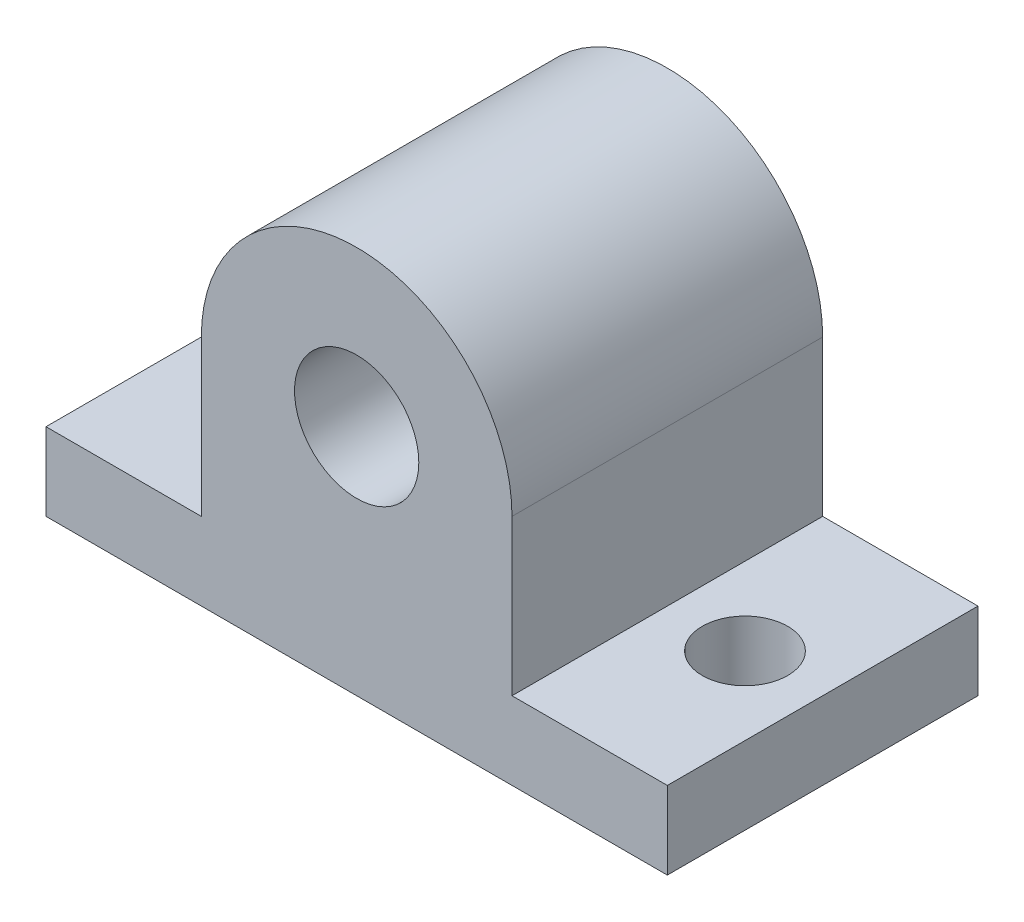
ISO-10303-21;
HEADER;
FILE_DESCRIPTION(('STEP AP214'),'2;1');
FILE_NAME('part.step','',(''),(''),'','','');
FILE_SCHEMA(('AUTOMOTIVE_DESIGN { 1 0 10303 214 1 1 1 1 }'));
ENDSEC;
DATA;
#1=APPLICATION_CONTEXT('core data for automotive mechanical design processes');
#2=APPLICATION_PROTOCOL_DEFINITION('international standard','automotive_design',2000,#1);
#3=PRODUCT_CONTEXT('',#1,'mechanical');
#4=PRODUCT('Part','Part','',(#3));
#5=PRODUCT_RELATED_PRODUCT_CATEGORY('part','',(#4));
#6=PRODUCT_DEFINITION_FORMATION('','',#4);
#7=PRODUCT_DEFINITION_CONTEXT('part definition',#1,'design');
#8=PRODUCT_DEFINITION('design','',#6,#7);
#9=PRODUCT_DEFINITION_SHAPE('','',#8);
#10=(LENGTH_UNIT() NAMED_UNIT(*) SI_UNIT(.MILLI.,.METRE.));
#11=(NAMED_UNIT(*) PLANE_ANGLE_UNIT() SI_UNIT($,.RADIAN.));
#12=(NAMED_UNIT(*) SI_UNIT($,.STERADIAN.) SOLID_ANGLE_UNIT());
#13=UNCERTAINTY_MEASURE_WITH_UNIT(LENGTH_MEASURE(1.E-05),#10,'distance_accuracy_value','');
#14=(GEOMETRIC_REPRESENTATION_CONTEXT(3) GLOBAL_UNCERTAINTY_ASSIGNED_CONTEXT((#13)) GLOBAL_UNIT_ASSIGNED_CONTEXT((#10,
#11,#12)) REPRESENTATION_CONTEXT('',''));
#15=CARTESIAN_POINT('',(0.,0.,0.));
#16=DIRECTION('',(0.,0.,1.));
#17=DIRECTION('',(1.,0.,0.));
#18=AXIS2_PLACEMENT_3D('',#15,#16,#17);
#19=CARTESIAN_POINT('',(0.,5.,0.));
#20=DIRECTION('',(0.,1.,0.));
#21=DIRECTION('',(0.,0.,1.));
#22=AXIS2_PLACEMENT_3D('',#19,#20,#21);
#23=PLANE('',#22);
#24=CARTESIAN_POINT('',(18.5220125786164,5.,5.15723270440251));
#25=DIRECTION('',(0.,1.,0.));
#26=DIRECTION('',(0.,0.,1.));
#27=AXIS2_PLACEMENT_3D('',#24,#25,#26);
#28=CIRCLE('',#27,2.75);
#29=CARTESIAN_POINT('',(18.5220125786164,5.,7.90723270440251));
#30=VERTEX_POINT('',#29);
#31=EDGE_CURVE('E186',#30,#30,#28,.T.);
#32=ORIENTED_EDGE('',*,*,#31,.F.);
#33=EDGE_LOOP('',(#32));
#34=FACE_BOUND('',#33,.T.);
#35=DIRECTION('',(-1.,0.,0.));
#36=VECTOR('',#35,1.);
#37=CARTESIAN_POINT('',(-16.4779874213836,5.,-4.84276729559749));
#38=LINE('',#37,#36);
#39=CARTESIAN_POINT('',(23.5220125786164,5.,-4.84276729559749));
#40=VERTEX_POINT('',#39);
#41=CARTESIAN_POINT('',(13.5220125786164,5.,-4.84276729559749));
#42=VERTEX_POINT('',#41);
#43=EDGE_CURVE('E58',#40,#42,#38,.T.);
#44=ORIENTED_EDGE('',*,*,#43,.T.);
#45=DIRECTION('',(0.,0.,1.));
#46=VECTOR('',#45,1.);
#47=CARTESIAN_POINT('',(13.5220125786164,5.,-33.1270385430594));
#48=LINE('',#47,#46);
#49=CARTESIAN_POINT('',(13.5220125786164,5.,15.1572327044025));
#50=VERTEX_POINT('',#49);
#51=EDGE_CURVE('E133',#42,#50,#48,.T.);
#52=ORIENTED_EDGE('',*,*,#51,.T.);
#53=DIRECTION('',(1.,0.,0.));
#54=VECTOR('',#53,1.);
#55=CARTESIAN_POINT('',(-16.4779874213836,5.,15.1572327044025));
#56=LINE('',#55,#54);
#57=CARTESIAN_POINT('',(23.5220125786164,5.,15.1572327044025));
#58=VERTEX_POINT('',#57);
#59=EDGE_CURVE('E144',#50,#58,#56,.T.);
#60=ORIENTED_EDGE('',*,*,#59,.T.);
#61=DIRECTION('',(0.,0.,-1.));
#62=VECTOR('',#61,1.);
#63=CARTESIAN_POINT('',(23.5220125786164,5.,-4.84276729559749));
#64=LINE('',#63,#62);
#65=EDGE_CURVE('E148',#58,#40,#64,.T.);
#66=ORIENTED_EDGE('',*,*,#65,.T.);
#67=EDGE_LOOP('',(#44,#52,#60,#66));
#68=FACE_BOUND('',#67,.T.);
#69=ADVANCED_FACE('F35',(#34,#68),#23,.T.);
#70=CARTESIAN_POINT('',(-16.4779874213836,5.,-4.84276729559749));
#71=DIRECTION('',(1.,0.,0.));
#72=DIRECTION('',(0.,0.,-1.));
#73=AXIS2_PLACEMENT_3D('',#70,#71,#72);
#74=PLANE('',#73);
#75=DIRECTION('',(0.,0.,1.));
#76=VECTOR('',#75,1.);
#77=CARTESIAN_POINT('',(-16.4779874213836,0.,-4.84276729559749));
#78=LINE('',#77,#76);
#79=CARTESIAN_POINT('',(-16.4779874213836,0.,-4.84276729559749));
#80=VERTEX_POINT('',#79);
#81=CARTESIAN_POINT('',(-16.4779874213836,0.,15.1572327044025));
#82=VERTEX_POINT('',#81);
#83=EDGE_CURVE('E139',#80,#82,#78,.T.);
#84=ORIENTED_EDGE('',*,*,#83,.T.);
#85=DIRECTION('',(0.,-1.,0.));
#86=VECTOR('',#85,1.);
#87=CARTESIAN_POINT('',(-16.4779874213836,5.,15.1572327044025));
#88=LINE('',#87,#86);
#89=CARTESIAN_POINT('',(-16.4779874213836,5.,15.1572327044025));
#90=VERTEX_POINT('',#89);
#91=EDGE_CURVE('E11',#90,#82,#88,.T.);
#92=ORIENTED_EDGE('',*,*,#91,.F.);
#93=DIRECTION('',(0.,0.,1.));
#94=VECTOR('',#93,1.);
#95=CARTESIAN_POINT('',(-16.4779874213836,5.,-4.84276729559749));
#96=LINE('',#95,#94);
#97=CARTESIAN_POINT('',(-16.4779874213836,5.,-4.84276729559749));
#98=VERTEX_POINT('',#97);
#99=EDGE_CURVE('E141',#98,#90,#96,.T.);
#100=ORIENTED_EDGE('',*,*,#99,.F.);
#101=DIRECTION('',(0.,-1.,0.));
#102=VECTOR('',#101,1.);
#103=CARTESIAN_POINT('',(-16.4779874213836,5.,-4.84276729559749));
#104=LINE('',#103,#102);
#105=EDGE_CURVE('E152',#98,#80,#104,.T.);
#106=ORIENTED_EDGE('',*,*,#105,.T.);
#107=EDGE_LOOP('',(#84,#92,#100,#106));
#108=FACE_BOUND('',#107,.T.);
#109=ADVANCED_FACE('F37',(#108),#74,.F.);
#110=CARTESIAN_POINT('',(-16.4779874213836,5.,15.1572327044025));
#111=DIRECTION('',(0.,0.,-1.));
#112=DIRECTION('',(-1.,0.,0.));
#113=AXIS2_PLACEMENT_3D('',#110,#111,#112);
#114=PLANE('',#113);
#115=DIRECTION('',(1.,0.,0.));
#116=VECTOR('',#115,1.);
#117=CARTESIAN_POINT('',(-16.4779874213836,0.,15.1572327044025));
#118=LINE('',#117,#116);
#119=CARTESIAN_POINT('',(23.5220125786164,0.,15.1572327044025));
#120=VERTEX_POINT('',#119);
#121=EDGE_CURVE('E155',#82,#120,#118,.T.);
#122=ORIENTED_EDGE('',*,*,#121,.T.);
#123=DIRECTION('',(0.,-1.,0.));
#124=VECTOR('',#123,1.);
#125=CARTESIAN_POINT('',(23.5220125786164,5.,15.1572327044025));
#126=LINE('',#125,#124);
#127=EDGE_CURVE('E43',#58,#120,#126,.T.);
#128=ORIENTED_EDGE('',*,*,#127,.F.);
#129=ORIENTED_EDGE('',*,*,#59,.F.);
#130=DIRECTION('',(0.,1.,0.));
#131=VECTOR('',#130,1.);
#132=CARTESIAN_POINT('',(13.5220125786164,15.,15.1572327044025));
#133=LINE('',#132,#131);
#134=CARTESIAN_POINT('',(13.5220125786164,15.,15.1572327044025));
#135=VERTEX_POINT('',#134);
#136=EDGE_CURVE('E111',#50,#135,#133,.T.);
#137=ORIENTED_EDGE('',*,*,#136,.T.);
#138=CARTESIAN_POINT('',(3.52201257861635,15.,15.1572327044025));
#139=DIRECTION('',(0.,0.,1.));
#140=DIRECTION('',(1.,0.,0.));
#141=AXIS2_PLACEMENT_3D('',#138,#139,#140);
#142=CIRCLE('',#141,10.);
#143=CARTESIAN_POINT('',(-6.47798742138365,15.,15.1572327044025));
#144=VERTEX_POINT('',#143);
#145=EDGE_CURVE('E106',#135,#144,#142,.T.);
#146=ORIENTED_EDGE('',*,*,#145,.T.);
#147=DIRECTION('',(0.,-1.,0.));
#148=VECTOR('',#147,1.);
#149=CARTESIAN_POINT('',(-6.47798742138365,15.,15.1572327044025));
#150=LINE('',#149,#148);
#151=CARTESIAN_POINT('',(-6.47798742138365,5.,15.1572327044025));
#152=VERTEX_POINT('',#151);
#153=EDGE_CURVE('E114',#144,#152,#150,.T.);
#154=ORIENTED_EDGE('',*,*,#153,.T.);
#155=EDGE_CURVE('E146',#90,#152,#56,.T.);
#156=ORIENTED_EDGE('',*,*,#155,.F.);
#157=ORIENTED_EDGE('',*,*,#91,.T.);
#158=EDGE_LOOP('',(#122,#128,#129,#137,#146,#154,#156,#157));
#159=FACE_BOUND('',#158,.T.);
#160=CARTESIAN_POINT('',(3.52201257861635,15.,15.1572327044025));
#161=DIRECTION('',(0.,0.,1.));
#162=DIRECTION('',(1.,0.,0.));
#163=AXIS2_PLACEMENT_3D('',#160,#161,#162);
#164=CIRCLE('',#163,4.);
#165=CARTESIAN_POINT('',(7.52201257861635,15.,15.1572327044025));
#166=VERTEX_POINT('',#165);
#167=EDGE_CURVE('E122',#166,#166,#164,.T.);
#168=ORIENTED_EDGE('',*,*,#167,.F.);
#169=EDGE_LOOP('',(#168));
#170=FACE_BOUND('',#169,.T.);
#171=ADVANCED_FACE('F118',(#159,#170),#114,.F.);
#172=CARTESIAN_POINT('',(23.5220125786164,5.,-4.84276729559749));
#173=DIRECTION('',(-1.,0.,0.));
#174=DIRECTION('',(0.,0.,1.));
#175=AXIS2_PLACEMENT_3D('',#172,#173,#174);
#176=PLANE('',#175);
#177=DIRECTION('',(0.,0.,-1.));
#178=VECTOR('',#177,1.);
#179=CARTESIAN_POINT('',(23.5220125786164,0.,-4.84276729559749));
#180=LINE('',#179,#178);
#181=CARTESIAN_POINT('',(23.5220125786164,0.,-4.84276729559749));
#182=VERTEX_POINT('',#181);
#183=EDGE_CURVE('E157',#120,#182,#180,.T.);
#184=ORIENTED_EDGE('',*,*,#183,.T.);
#185=DIRECTION('',(0.,-1.,0.));
#186=VECTOR('',#185,1.);
#187=CARTESIAN_POINT('',(23.5220125786164,5.,-4.84276729559749));
#188=LINE('',#187,#186);
#189=EDGE_CURVE('E162',#40,#182,#188,.T.);
#190=ORIENTED_EDGE('',*,*,#189,.F.);
#191=ORIENTED_EDGE('',*,*,#65,.F.);
#192=ORIENTED_EDGE('',*,*,#127,.T.);
#193=EDGE_LOOP('',(#184,#190,#191,#192));
#194=FACE_BOUND('',#193,.T.);
#195=ADVANCED_FACE('F169',(#194),#176,.F.);
#196=CARTESIAN_POINT('',(-16.4779874213836,5.,-4.84276729559749));
#197=DIRECTION('',(0.,0.,1.));
#198=DIRECTION('',(1.,0.,0.));
#199=AXIS2_PLACEMENT_3D('',#196,#197,#198);
#200=PLANE('',#199);
#201=DIRECTION('',(-1.,0.,0.));
#202=VECTOR('',#201,1.);
#203=CARTESIAN_POINT('',(-16.4779874213836,0.,-4.84276729559749));
#204=LINE('',#203,#202);
#205=EDGE_CURVE('E145',#182,#80,#204,.T.);
#206=ORIENTED_EDGE('',*,*,#205,.T.);
#207=ORIENTED_EDGE('',*,*,#105,.F.);
#208=CARTESIAN_POINT('',(-6.47798742138365,5.,-4.84276729559749));
#209=VERTEX_POINT('',#208);
#210=EDGE_CURVE('E150',#209,#98,#38,.T.);
#211=ORIENTED_EDGE('',*,*,#210,.F.);
#212=DIRECTION('',(0.,1.,0.));
#213=VECTOR('',#212,1.);
#214=CARTESIAN_POINT('',(-6.47798742138365,15.,-4.84276729559749));
#215=LINE('',#214,#213);
#216=CARTESIAN_POINT('',(-6.47798742138365,15.,-4.84276729559749));
#217=VERTEX_POINT('',#216);
#218=EDGE_CURVE('E140',#209,#217,#215,.T.);
#219=ORIENTED_EDGE('',*,*,#218,.T.);
#220=CARTESIAN_POINT('',(3.52201257861635,15.,-4.84276729559749));
#221=DIRECTION('',(0.,0.,1.));
#222=DIRECTION('',(1.,0.,0.));
#223=AXIS2_PLACEMENT_3D('',#220,#221,#222);
#224=CIRCLE('',#223,10.);
#225=CARTESIAN_POINT('',(13.5220125786164,15.,-4.84276729559749));
#226=VERTEX_POINT('',#225);
#227=EDGE_CURVE('E108',#217,#226,#224,.F.);
#228=ORIENTED_EDGE('',*,*,#227,.T.);
#229=DIRECTION('',(0.,-1.,0.));
#230=VECTOR('',#229,1.);
#231=CARTESIAN_POINT('',(13.5220125786164,15.,-4.84276729559749));
#232=LINE('',#231,#230);
#233=EDGE_CURVE('E132',#226,#42,#232,.T.);
#234=ORIENTED_EDGE('',*,*,#233,.T.);
#235=ORIENTED_EDGE('',*,*,#43,.F.);
#236=ORIENTED_EDGE('',*,*,#189,.T.);
#237=EDGE_LOOP('',(#206,#207,#211,#219,#228,#234,#235,#236));
#238=FACE_BOUND('',#237,.T.);
#239=CARTESIAN_POINT('',(3.52201257861635,15.,-4.84276729559749));
#240=DIRECTION('',(0.,0.,1.));
#241=DIRECTION('',(1.,0.,0.));
#242=AXIS2_PLACEMENT_3D('',#239,#240,#241);
#243=CIRCLE('',#242,4.);
#244=CARTESIAN_POINT('',(7.52201257861635,15.,-4.84276729559749));
#245=VERTEX_POINT('',#244);
#246=EDGE_CURVE('E136',#245,#245,#243,.F.);
#247=ORIENTED_EDGE('',*,*,#246,.F.);
#248=EDGE_LOOP('',(#247));
#249=FACE_BOUND('',#248,.T.);
#250=ADVANCED_FACE('F177',(#238,#249),#200,.F.);
#251=CARTESIAN_POINT('',(-11.4779874213836,5.,5.15723270440251));
#252=DIRECTION('',(0.,1.,0.));
#253=DIRECTION('',(0.,0.,1.));
#254=AXIS2_PLACEMENT_3D('',#251,#252,#253);
#255=CIRCLE('',#254,2.75);
#256=CARTESIAN_POINT('',(-11.4779874213836,5.,7.90723270440251));
#257=VERTEX_POINT('',#256);
#258=EDGE_CURVE('E211',#257,#257,#255,.T.);
#259=ORIENTED_EDGE('',*,*,#258,.F.);
#260=EDGE_LOOP('',(#259));
#261=FACE_BOUND('',#260,.T.);
#262=DIRECTION('',(0.,0.,1.));
#263=VECTOR('',#262,1.);
#264=CARTESIAN_POINT('',(-6.47798742138365,5.,-33.1270385430594));
#265=LINE('',#264,#263);
#266=EDGE_CURVE('E50',#209,#152,#265,.T.);
#267=ORIENTED_EDGE('',*,*,#266,.F.);
#268=ORIENTED_EDGE('',*,*,#210,.T.);
#269=ORIENTED_EDGE('',*,*,#99,.T.);
#270=ORIENTED_EDGE('',*,*,#155,.T.);
#271=EDGE_LOOP('',(#267,#268,#269,#270));
#272=FACE_BOUND('',#271,.T.);
#273=ADVANCED_FACE('F182',(#261,#272),#23,.T.);
#274=CARTESIAN_POINT('',(0.,0.,0.));
#275=DIRECTION('',(0.,1.,0.));
#276=DIRECTION('',(0.,0.,1.));
#277=AXIS2_PLACEMENT_3D('',#274,#275,#276);
#278=PLANE('',#277);
#279=CARTESIAN_POINT('',(-11.4779874213836,0.,5.15723270440251));
#280=DIRECTION('',(0.,1.,0.));
#281=DIRECTION('',(0.,0.,1.));
#282=AXIS2_PLACEMENT_3D('',#279,#280,#281);
#283=CIRCLE('',#282,2.75);
#284=CARTESIAN_POINT('',(-11.4779874213836,0.,7.90723270440251));
#285=VERTEX_POINT('',#284);
#286=EDGE_CURVE('E125',#285,#285,#283,.T.);
#287=ORIENTED_EDGE('',*,*,#286,.T.);
#288=EDGE_LOOP('',(#287));
#289=FACE_BOUND('',#288,.T.);
#290=CARTESIAN_POINT('',(18.5220125786164,0.,5.15723270440251));
#291=DIRECTION('',(0.,1.,0.));
#292=DIRECTION('',(0.,0.,1.));
#293=AXIS2_PLACEMENT_3D('',#290,#291,#292);
#294=CIRCLE('',#293,2.75);
#295=CARTESIAN_POINT('',(18.5220125786164,0.,7.90723270440251));
#296=VERTEX_POINT('',#295);
#297=EDGE_CURVE('E213',#296,#296,#294,.T.);
#298=ORIENTED_EDGE('',*,*,#297,.T.);
#299=EDGE_LOOP('',(#298));
#300=FACE_BOUND('',#299,.T.);
#301=ORIENTED_EDGE('',*,*,#83,.F.);
#302=ORIENTED_EDGE('',*,*,#205,.F.);
#303=ORIENTED_EDGE('',*,*,#183,.F.);
#304=ORIENTED_EDGE('',*,*,#121,.F.);
#305=EDGE_LOOP('',(#301,#302,#303,#304));
#306=FACE_BOUND('',#305,.T.);
#307=ADVANCED_FACE('F174',(#289,#300,#306),#278,.F.);
#308=CARTESIAN_POINT('',(-6.47798742138365,15.,-33.1270385430594));
#309=DIRECTION('',(-1.,0.,0.));
#310=DIRECTION('',(0.,0.,1.));
#311=AXIS2_PLACEMENT_3D('',#308,#309,#310);
#312=PLANE('',#311);
#313=ORIENTED_EDGE('',*,*,#218,.F.);
#314=ORIENTED_EDGE('',*,*,#266,.T.);
#315=ORIENTED_EDGE('',*,*,#153,.F.);
#316=DIRECTION('',(0.,0.,1.));
#317=VECTOR('',#316,1.);
#318=CARTESIAN_POINT('',(-6.47798742138365,15.,-33.1270385430594));
#319=LINE('',#318,#317);
#320=EDGE_CURVE('E101',#217,#144,#319,.T.);
#321=ORIENTED_EDGE('',*,*,#320,.F.);
#322=EDGE_LOOP('',(#313,#314,#315,#321));
#323=FACE_BOUND('',#322,.T.);
#324=ADVANCED_FACE('F115',(#323),#312,.T.);
#325=CARTESIAN_POINT('',(13.5220125786164,15.,-33.1270385430594));
#326=DIRECTION('',(1.,0.,0.));
#327=DIRECTION('',(0.,1.,0.));
#328=AXIS2_PLACEMENT_3D('',#325,#326,#327);
#329=PLANE('',#328);
#330=ORIENTED_EDGE('',*,*,#233,.F.);
#331=DIRECTION('',(0.,0.,1.));
#332=VECTOR('',#331,1.);
#333=CARTESIAN_POINT('',(13.5220125786164,15.,-33.1270385430594));
#334=LINE('',#333,#332);
#335=EDGE_CURVE('E130',#226,#135,#334,.T.);
#336=ORIENTED_EDGE('',*,*,#335,.T.);
#337=ORIENTED_EDGE('',*,*,#136,.F.);
#338=ORIENTED_EDGE('',*,*,#51,.F.);
#339=EDGE_LOOP('',(#330,#336,#337,#338));
#340=FACE_BOUND('',#339,.T.);
#341=ADVANCED_FACE('F191',(#340),#329,.T.);
#342=CARTESIAN_POINT('',(3.52201257861635,15.,-33.1270385430594));
#343=DIRECTION('',(0.,0.,1.));
#344=DIRECTION('',(1.,0.,0.));
#345=AXIS2_PLACEMENT_3D('',#342,#343,#344);
#346=CYLINDRICAL_SURFACE('',#345,10.);
#347=ORIENTED_EDGE('',*,*,#227,.F.);
#348=ORIENTED_EDGE('',*,*,#320,.T.);
#349=ORIENTED_EDGE('',*,*,#145,.F.);
#350=ORIENTED_EDGE('',*,*,#335,.F.);
#351=EDGE_LOOP('',(#347,#348,#349,#350));
#352=FACE_BOUND('',#351,.T.);
#353=ADVANCED_FACE('F103',(#352),#346,.T.);
#354=CARTESIAN_POINT('',(3.52201257861635,15.,-33.1270385430594));
#355=DIRECTION('',(0.,0.,1.));
#356=DIRECTION('',(1.,0.,0.));
#357=AXIS2_PLACEMENT_3D('',#354,#355,#356);
#358=CYLINDRICAL_SURFACE('',#357,4.);
#359=ORIENTED_EDGE('',*,*,#246,.T.);
#360=EDGE_LOOP('',(#359));
#361=FACE_BOUND('',#360,.T.);
#362=ORIENTED_EDGE('',*,*,#167,.T.);
#363=EDGE_LOOP('',(#362));
#364=FACE_BOUND('',#363,.T.);
#365=ADVANCED_FACE('F225',(#361,#364),#358,.F.);
#366=CARTESIAN_POINT('',(18.5220125786164,0.,5.15723270440251));
#367=DIRECTION('',(0.,1.,0.));
#368=DIRECTION('',(0.,0.,1.));
#369=AXIS2_PLACEMENT_3D('',#366,#367,#368);
#370=CYLINDRICAL_SURFACE('',#369,2.75);
#371=ORIENTED_EDGE('',*,*,#297,.F.);
#372=EDGE_LOOP('',(#371));
#373=FACE_BOUND('',#372,.T.);
#374=ORIENTED_EDGE('',*,*,#31,.T.);
#375=EDGE_LOOP('',(#374));
#376=FACE_BOUND('',#375,.T.);
#377=ADVANCED_FACE('F222',(#373,#376),#370,.F.);
#378=CARTESIAN_POINT('',(-11.4779874213836,0.,5.15723270440251));
#379=DIRECTION('',(0.,1.,0.));
#380=DIRECTION('',(0.,0.,1.));
#381=AXIS2_PLACEMENT_3D('',#378,#379,#380);
#382=CYLINDRICAL_SURFACE('',#381,2.75);
#383=ORIENTED_EDGE('',*,*,#286,.F.);
#384=EDGE_LOOP('',(#383));
#385=FACE_BOUND('',#384,.T.);
#386=ORIENTED_EDGE('',*,*,#258,.T.);
#387=EDGE_LOOP('',(#386));
#388=FACE_BOUND('',#387,.T.);
#389=ADVANCED_FACE('F224',(#385,#388),#382,.F.);
#390=CLOSED_SHELL('',(#69,#109,#171,#195,#250,#273,#307,#324,#341,#353,#365,#377,#389));
#391=MANIFOLD_SOLID_BREP('B2',#390);
#392=ADVANCED_BREP_SHAPE_REPRESENTATION('',(#18,#391),#14);
#393=SHAPE_DEFINITION_REPRESENTATION(#9,#392);
ENDSEC;
END-ISO-10303-21;
